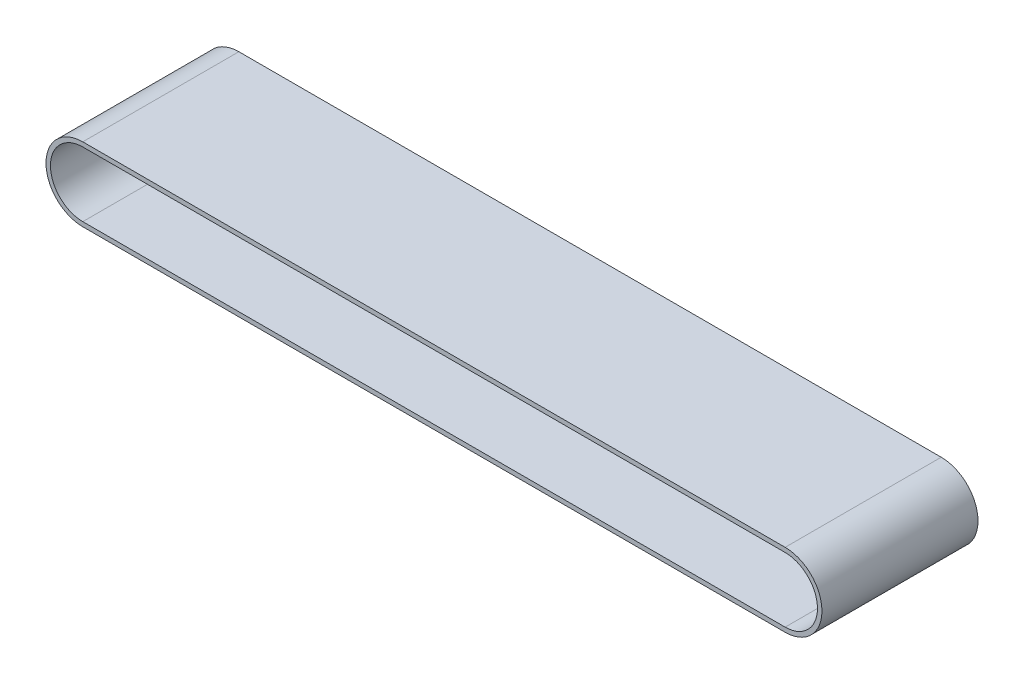
ISO-10303-21;
HEADER;
FILE_DESCRIPTION(('STEP AP214'),'2;1');
FILE_NAME('part.step','',(''),(''),'','','');
FILE_SCHEMA(('AUTOMOTIVE_DESIGN { 1 0 10303 214 1 1 1 1 }'));
ENDSEC;
DATA;
#1=APPLICATION_CONTEXT('core data for automotive mechanical design processes');
#2=APPLICATION_PROTOCOL_DEFINITION('international standard','automotive_design',2000,#1);
#3=PRODUCT_CONTEXT('',#1,'mechanical');
#4=PRODUCT('Part','Part','',(#3));
#5=PRODUCT_RELATED_PRODUCT_CATEGORY('part','',(#4));
#6=PRODUCT_DEFINITION_FORMATION('','',#4);
#7=PRODUCT_DEFINITION_CONTEXT('part definition',#1,'design');
#8=PRODUCT_DEFINITION('design','',#6,#7);
#9=PRODUCT_DEFINITION_SHAPE('','',#8);
#10=(LENGTH_UNIT() NAMED_UNIT(*) SI_UNIT(.MILLI.,.METRE.));
#11=(NAMED_UNIT(*) PLANE_ANGLE_UNIT() SI_UNIT($,.RADIAN.));
#12=(NAMED_UNIT(*) SI_UNIT($,.STERADIAN.) SOLID_ANGLE_UNIT());
#13=UNCERTAINTY_MEASURE_WITH_UNIT(LENGTH_MEASURE(1.E-05),#10,'distance_accuracy_value','');
#14=(GEOMETRIC_REPRESENTATION_CONTEXT(3) GLOBAL_UNCERTAINTY_ASSIGNED_CONTEXT((#13)) GLOBAL_UNIT_ASSIGNED_CONTEXT((#10,
#11,#12)) REPRESENTATION_CONTEXT('',''));
#15=CARTESIAN_POINT('',(0.,0.,0.));
#16=DIRECTION('',(0.,0.,1.));
#17=DIRECTION('',(1.,0.,0.));
#18=AXIS2_PLACEMENT_3D('',#15,#16,#17);
#19=CARTESIAN_POINT('',(-315.000000000003,-12.4999999999766,35.));
#20=DIRECTION('',(0.,-1.,0.));
#21=DIRECTION('',(0.,0.,-1.));
#22=AXIS2_PLACEMENT_3D('',#19,#20,#21);
#23=PLANE('',#22);
#24=DIRECTION('',(-1.,0.,0.));
#25=VECTOR('',#24,1.);
#26=CARTESIAN_POINT('',(-315.000000000003,-12.4999999999766,-35.));
#27=LINE('',#26,#25);
#28=CARTESIAN_POINT('',(-8.10647598978829E-13,-12.4999999999766,-35.));
#29=VERTEX_POINT('',#28);
#30=CARTESIAN_POINT('',(-315.000000000001,-12.4999999999766,-35.));
#31=VERTEX_POINT('',#30);
#32=EDGE_CURVE('E165',#29,#31,#27,.T.);
#33=ORIENTED_EDGE('',*,*,#32,.F.);
#34=DIRECTION('',(0.,0.,-1.));
#35=VECTOR('',#34,1.);
#36=CARTESIAN_POINT('',(-8.10647598978829E-13,-12.4999999999766,35.));
#37=LINE('',#36,#35);
#38=CARTESIAN_POINT('',(-8.10647598978829E-13,-12.4999999999766,35.));
#39=VERTEX_POINT('',#38);
#40=EDGE_CURVE('E12',#39,#29,#37,.T.);
#41=ORIENTED_EDGE('',*,*,#40,.F.);
#42=DIRECTION('',(-1.,0.,0.));
#43=VECTOR('',#42,1.);
#44=CARTESIAN_POINT('',(-315.000000000003,-12.4999999999766,35.));
#45=LINE('',#44,#43);
#46=CARTESIAN_POINT('',(-315.000000000001,-12.4999999999766,35.));
#47=VERTEX_POINT('',#46);
#48=EDGE_CURVE('E169',#39,#47,#45,.T.);
#49=ORIENTED_EDGE('',*,*,#48,.T.);
#50=DIRECTION('',(0.,0.,-1.));
#51=VECTOR('',#50,1.);
#52=CARTESIAN_POINT('',(-315.000000000001,-12.4999999999766,35.));
#53=LINE('',#52,#51);
#54=EDGE_CURVE('E70',#47,#31,#53,.T.);
#55=ORIENTED_EDGE('',*,*,#54,.T.);
#56=EDGE_LOOP('',(#33,#41,#49,#55));
#57=FACE_BOUND('',#56,.T.);
#58=ADVANCED_FACE('F67',(#57),#23,.T.);
#59=CARTESIAN_POINT('',(-2.4696872633376E-12,4.00000000002342,35.));
#60=DIRECTION('',(0.,0.,-1.));
#61=DIRECTION('',(-1.,0.,0.));
#62=AXIS2_PLACEMENT_3D('',#59,#60,#61);
#63=CYLINDRICAL_SURFACE('',#62,16.5);
#64=CARTESIAN_POINT('',(-2.4696872633376E-12,4.00000000002342,-35.));
#65=DIRECTION('',(0.,0.,-1.));
#66=DIRECTION('',(-1.,0.,0.));
#67=AXIS2_PLACEMENT_3D('',#64,#65,#66);
#68=CIRCLE('',#67,16.5);
#69=CARTESIAN_POINT('',(-3.94129173741931E-12,20.5000000000234,-35.));
#70=VERTEX_POINT('',#69);
#71=EDGE_CURVE('E173',#70,#29,#68,.T.);
#72=ORIENTED_EDGE('',*,*,#71,.F.);
#73=DIRECTION('',(0.,0.,-1.));
#74=VECTOR('',#73,1.);
#75=CARTESIAN_POINT('',(-3.94129173741931E-12,20.5000000000234,35.));
#76=LINE('',#75,#74);
#77=CARTESIAN_POINT('',(-3.94129173741931E-12,20.5000000000234,35.));
#78=VERTEX_POINT('',#77);
#79=EDGE_CURVE('E75',#78,#70,#76,.T.);
#80=ORIENTED_EDGE('',*,*,#79,.F.);
#81=CARTESIAN_POINT('',(-2.4696872633376E-12,4.00000000002342,35.));
#82=DIRECTION('',(0.,0.,-1.));
#83=DIRECTION('',(-1.,0.,0.));
#84=AXIS2_PLACEMENT_3D('',#81,#82,#83);
#85=CIRCLE('',#84,16.5);
#86=EDGE_CURVE('E179',#78,#39,#85,.T.);
#87=ORIENTED_EDGE('',*,*,#86,.T.);
#88=ORIENTED_EDGE('',*,*,#40,.T.);
#89=EDGE_LOOP('',(#72,#80,#87,#88));
#90=FACE_BOUND('',#89,.T.);
#91=ADVANCED_FACE('F205',(#90),#63,.T.);
#92=CARTESIAN_POINT('',(-315.000000000003,20.5000000000234,35.));
#93=DIRECTION('',(0.,1.,0.));
#94=DIRECTION('',(0.,0.,1.));
#95=AXIS2_PLACEMENT_3D('',#92,#93,#94);
#96=PLANE('',#95);
#97=DIRECTION('',(1.,0.,0.));
#98=VECTOR('',#97,1.);
#99=CARTESIAN_POINT('',(-315.000000000003,20.5000000000234,-35.));
#100=LINE('',#99,#98);
#101=CARTESIAN_POINT('',(-315.000000000004,20.5000000000234,-35.));
#102=VERTEX_POINT('',#101);
#103=EDGE_CURVE('E187',#102,#70,#100,.T.);
#104=ORIENTED_EDGE('',*,*,#103,.F.);
#105=DIRECTION('',(0.,0.,-1.));
#106=VECTOR('',#105,1.);
#107=CARTESIAN_POINT('',(-315.000000000004,20.5000000000234,35.));
#108=LINE('',#107,#106);
#109=CARTESIAN_POINT('',(-315.000000000004,20.5000000000234,35.));
#110=VERTEX_POINT('',#109);
#111=EDGE_CURVE('E192',#110,#102,#108,.T.);
#112=ORIENTED_EDGE('',*,*,#111,.F.);
#113=DIRECTION('',(1.,0.,0.));
#114=VECTOR('',#113,1.);
#115=CARTESIAN_POINT('',(-315.000000000003,20.5000000000234,35.));
#116=LINE('',#115,#114);
#117=EDGE_CURVE('E176',#110,#78,#116,.T.);
#118=ORIENTED_EDGE('',*,*,#117,.T.);
#119=ORIENTED_EDGE('',*,*,#79,.T.);
#120=EDGE_LOOP('',(#104,#112,#118,#119));
#121=FACE_BOUND('',#120,.T.);
#122=ADVANCED_FACE('F209',(#121),#96,.T.);
#123=CARTESIAN_POINT('',(-315.000000000003,4.00000000002342,35.));
#124=DIRECTION('',(0.,0.,-1.));
#125=DIRECTION('',(-1.,0.,0.));
#126=AXIS2_PLACEMENT_3D('',#123,#124,#125);
#127=CYLINDRICAL_SURFACE('',#126,16.5);
#128=CARTESIAN_POINT('',(-315.000000000003,4.00000000002342,-35.));
#129=DIRECTION('',(0.,0.,-1.));
#130=DIRECTION('',(-1.,0.,0.));
#131=AXIS2_PLACEMENT_3D('',#128,#129,#130);
#132=CIRCLE('',#131,16.5);
#133=EDGE_CURVE('E184',#31,#102,#132,.T.);
#134=ORIENTED_EDGE('',*,*,#133,.F.);
#135=ORIENTED_EDGE('',*,*,#54,.F.);
#136=CARTESIAN_POINT('',(-315.000000000003,4.00000000002342,35.));
#137=DIRECTION('',(0.,0.,-1.));
#138=DIRECTION('',(-1.,0.,0.));
#139=AXIS2_PLACEMENT_3D('',#136,#137,#138);
#140=CIRCLE('',#139,16.5);
#141=EDGE_CURVE('E172',#47,#110,#140,.T.);
#142=ORIENTED_EDGE('',*,*,#141,.T.);
#143=ORIENTED_EDGE('',*,*,#111,.T.);
#144=EDGE_LOOP('',(#134,#135,#142,#143));
#145=FACE_BOUND('',#144,.T.);
#146=ADVANCED_FACE('F200',(#145),#127,.T.);
#147=CARTESIAN_POINT('',(-315.000000000003,4.00000000002342,35.));
#148=DIRECTION('',(0.,0.,-1.));
#149=DIRECTION('',(-1.,0.,0.));
#150=AXIS2_PLACEMENT_3D('',#147,#148,#149);
#151=PLANE('',#150);
#152=CARTESIAN_POINT('',(-2.4696872633376E-12,4.00000000002342,35.));
#153=DIRECTION('',(0.,0.,-1.));
#154=DIRECTION('',(-1.,0.,0.));
#155=AXIS2_PLACEMENT_3D('',#152,#153,#154);
#156=CIRCLE('',#155,14.5);
#157=CARTESIAN_POINT('',(-3.92703258579971E-12,18.5000000000234,35.));
#158=VERTEX_POINT('',#157);
#159=CARTESIAN_POINT('',(-1.0117433158708E-12,-10.4999999999766,35.));
#160=VERTEX_POINT('',#159);
#161=EDGE_CURVE('E140',#158,#160,#156,.T.);
#162=ORIENTED_EDGE('',*,*,#161,.T.);
#163=DIRECTION('',(-1.,0.,0.));
#164=VECTOR('',#163,1.);
#165=CARTESIAN_POINT('',(-1.0123419408755E-12,-10.4999999999766,35.));
#166=LINE('',#165,#164);
#167=CARTESIAN_POINT('',(-315.000000000001,-10.4999999999766,35.));
#168=VERTEX_POINT('',#167);
#169=EDGE_CURVE('E134',#160,#168,#166,.T.);
#170=ORIENTED_EDGE('',*,*,#169,.T.);
#171=CARTESIAN_POINT('',(-315.000000000003,4.00000000002342,35.));
#172=DIRECTION('',(0.,0.,-1.));
#173=DIRECTION('',(-1.,0.,0.));
#174=AXIS2_PLACEMENT_3D('',#171,#172,#173);
#175=CIRCLE('',#174,14.5);
#176=CARTESIAN_POINT('',(-315.000000000004,18.5000000000234,35.));
#177=VERTEX_POINT('',#176);
#178=EDGE_CURVE('E143',#168,#177,#175,.T.);
#179=ORIENTED_EDGE('',*,*,#178,.T.);
#180=DIRECTION('',(1.,0.,0.));
#181=VECTOR('',#180,1.);
#182=CARTESIAN_POINT('',(-315.000000000004,18.5000000000234,35.));
#183=LINE('',#182,#181);
#184=EDGE_CURVE('E83',#177,#158,#183,.T.);
#185=ORIENTED_EDGE('',*,*,#184,.T.);
#186=EDGE_LOOP('',(#162,#170,#179,#185));
#187=FACE_BOUND('',#186,.T.);
#188=ORIENTED_EDGE('',*,*,#48,.F.);
#189=ORIENTED_EDGE('',*,*,#86,.F.);
#190=ORIENTED_EDGE('',*,*,#117,.F.);
#191=ORIENTED_EDGE('',*,*,#141,.F.);
#192=EDGE_LOOP('',(#188,#189,#190,#191));
#193=FACE_BOUND('',#192,.T.);
#194=ADVANCED_FACE('F147',(#187,#193),#151,.F.);
#195=CARTESIAN_POINT('',(-315.000000000003,4.00000000002342,-35.));
#196=DIRECTION('',(0.,0.,-1.));
#197=DIRECTION('',(-1.,0.,0.));
#198=AXIS2_PLACEMENT_3D('',#195,#196,#197);
#199=PLANE('',#198);
#200=DIRECTION('',(-1.,0.,0.));
#201=VECTOR('',#200,1.);
#202=CARTESIAN_POINT('',(-1.0123419408755E-12,-10.4999999999766,-35.));
#203=LINE('',#202,#201);
#204=CARTESIAN_POINT('',(-1.0117433158708E-12,-10.4999999999766,-35.));
#205=VERTEX_POINT('',#204);
#206=CARTESIAN_POINT('',(-315.000000000001,-10.4999999999766,-35.));
#207=VERTEX_POINT('',#206);
#208=EDGE_CURVE('E91',#205,#207,#203,.T.);
#209=ORIENTED_EDGE('',*,*,#208,.F.);
#210=CARTESIAN_POINT('',(-2.4696872633376E-12,4.00000000002342,-35.));
#211=DIRECTION('',(0.,0.,-1.));
#212=DIRECTION('',(-1.,0.,0.));
#213=AXIS2_PLACEMENT_3D('',#210,#211,#212);
#214=CIRCLE('',#213,14.5);
#215=CARTESIAN_POINT('',(-3.92703258579971E-12,18.5000000000234,-35.));
#216=VERTEX_POINT('',#215);
#217=EDGE_CURVE('E150',#216,#205,#214,.T.);
#218=ORIENTED_EDGE('',*,*,#217,.F.);
#219=DIRECTION('',(1.,0.,0.));
#220=VECTOR('',#219,1.);
#221=CARTESIAN_POINT('',(-315.000000000004,18.5000000000234,-35.));
#222=LINE('',#221,#220);
#223=CARTESIAN_POINT('',(-315.000000000004,18.5000000000234,-35.));
#224=VERTEX_POINT('',#223);
#225=EDGE_CURVE('E153',#224,#216,#222,.T.);
#226=ORIENTED_EDGE('',*,*,#225,.F.);
#227=CARTESIAN_POINT('',(-315.000000000003,4.00000000002342,-35.));
#228=DIRECTION('',(0.,0.,-1.));
#229=DIRECTION('',(-1.,0.,0.));
#230=AXIS2_PLACEMENT_3D('',#227,#228,#229);
#231=CIRCLE('',#230,14.5);
#232=EDGE_CURVE('E159',#207,#224,#231,.T.);
#233=ORIENTED_EDGE('',*,*,#232,.F.);
#234=EDGE_LOOP('',(#209,#218,#226,#233));
#235=FACE_BOUND('',#234,.T.);
#236=ORIENTED_EDGE('',*,*,#32,.T.);
#237=ORIENTED_EDGE('',*,*,#133,.T.);
#238=ORIENTED_EDGE('',*,*,#103,.T.);
#239=ORIENTED_EDGE('',*,*,#71,.T.);
#240=EDGE_LOOP('',(#236,#237,#238,#239));
#241=FACE_BOUND('',#240,.T.);
#242=ADVANCED_FACE('F202',(#235,#241),#199,.T.);
#243=CARTESIAN_POINT('',(-1.0123419408755E-12,-10.4999999999766,35.));
#244=DIRECTION('',(0.,-1.,0.));
#245=DIRECTION('',(0.,0.,-1.));
#246=AXIS2_PLACEMENT_3D('',#243,#244,#245);
#247=PLANE('',#246);
#248=ORIENTED_EDGE('',*,*,#208,.T.);
#249=DIRECTION('',(0.,0.,-1.));
#250=VECTOR('',#249,1.);
#251=CARTESIAN_POINT('',(-315.000000000001,-10.4999999999766,35.));
#252=LINE('',#251,#250);
#253=EDGE_CURVE('E130',#168,#207,#252,.T.);
#254=ORIENTED_EDGE('',*,*,#253,.F.);
#255=ORIENTED_EDGE('',*,*,#169,.F.);
#256=DIRECTION('',(0.,0.,-1.));
#257=VECTOR('',#256,1.);
#258=CARTESIAN_POINT('',(-1.0117433158708E-12,-10.4999999999766,35.));
#259=LINE('',#258,#257);
#260=EDGE_CURVE('E163',#160,#205,#259,.T.);
#261=ORIENTED_EDGE('',*,*,#260,.T.);
#262=EDGE_LOOP('',(#248,#254,#255,#261));
#263=FACE_BOUND('',#262,.T.);
#264=ADVANCED_FACE('F132',(#263),#247,.F.);
#265=CARTESIAN_POINT('',(-2.4696872633376E-12,4.00000000002342,35.));
#266=DIRECTION('',(0.,0.,-1.));
#267=DIRECTION('',(-1.,0.,0.));
#268=AXIS2_PLACEMENT_3D('',#265,#266,#267);
#269=CYLINDRICAL_SURFACE('',#268,14.5);
#270=ORIENTED_EDGE('',*,*,#217,.T.);
#271=ORIENTED_EDGE('',*,*,#260,.F.);
#272=ORIENTED_EDGE('',*,*,#161,.F.);
#273=DIRECTION('',(0.,0.,-1.));
#274=VECTOR('',#273,1.);
#275=CARTESIAN_POINT('',(-3.92703258579971E-12,18.5000000000234,35.));
#276=LINE('',#275,#274);
#277=EDGE_CURVE('E166',#158,#216,#276,.T.);
#278=ORIENTED_EDGE('',*,*,#277,.T.);
#279=EDGE_LOOP('',(#270,#271,#272,#278));
#280=FACE_BOUND('',#279,.T.);
#281=ADVANCED_FACE('F260',(#280),#269,.F.);
#282=CARTESIAN_POINT('',(-315.000000000004,18.5000000000234,35.));
#283=DIRECTION('',(0.,1.,0.));
#284=DIRECTION('',(0.,0.,1.));
#285=AXIS2_PLACEMENT_3D('',#282,#283,#284);
#286=PLANE('',#285);
#287=ORIENTED_EDGE('',*,*,#225,.T.);
#288=ORIENTED_EDGE('',*,*,#277,.F.);
#289=ORIENTED_EDGE('',*,*,#184,.F.);
#290=DIRECTION('',(0.,0.,-1.));
#291=VECTOR('',#290,1.);
#292=CARTESIAN_POINT('',(-315.000000000004,18.5000000000234,35.));
#293=LINE('',#292,#291);
#294=EDGE_CURVE('E139',#177,#224,#293,.T.);
#295=ORIENTED_EDGE('',*,*,#294,.T.);
#296=EDGE_LOOP('',(#287,#288,#289,#295));
#297=FACE_BOUND('',#296,.T.);
#298=ADVANCED_FACE('F269',(#297),#286,.F.);
#299=CARTESIAN_POINT('',(-315.000000000003,4.00000000002342,35.));
#300=DIRECTION('',(0.,0.,-1.));
#301=DIRECTION('',(-1.,0.,0.));
#302=AXIS2_PLACEMENT_3D('',#299,#300,#301);
#303=CYLINDRICAL_SURFACE('',#302,14.5);
#304=ORIENTED_EDGE('',*,*,#232,.T.);
#305=ORIENTED_EDGE('',*,*,#294,.F.);
#306=ORIENTED_EDGE('',*,*,#178,.F.);
#307=ORIENTED_EDGE('',*,*,#253,.T.);
#308=EDGE_LOOP('',(#304,#305,#306,#307));
#309=FACE_BOUND('',#308,.T.);
#310=ADVANCED_FACE('F144',(#309),#303,.F.);
#311=CLOSED_SHELL('',(#58,#91,#122,#146,#194,#242,#264,#281,#298,#310));
#312=MANIFOLD_SOLID_BREP('B2',#311);
#313=ADVANCED_BREP_SHAPE_REPRESENTATION('',(#18,#312),#14);
#314=SHAPE_DEFINITION_REPRESENTATION(#9,#313);
ENDSEC;
END-ISO-10303-21;
